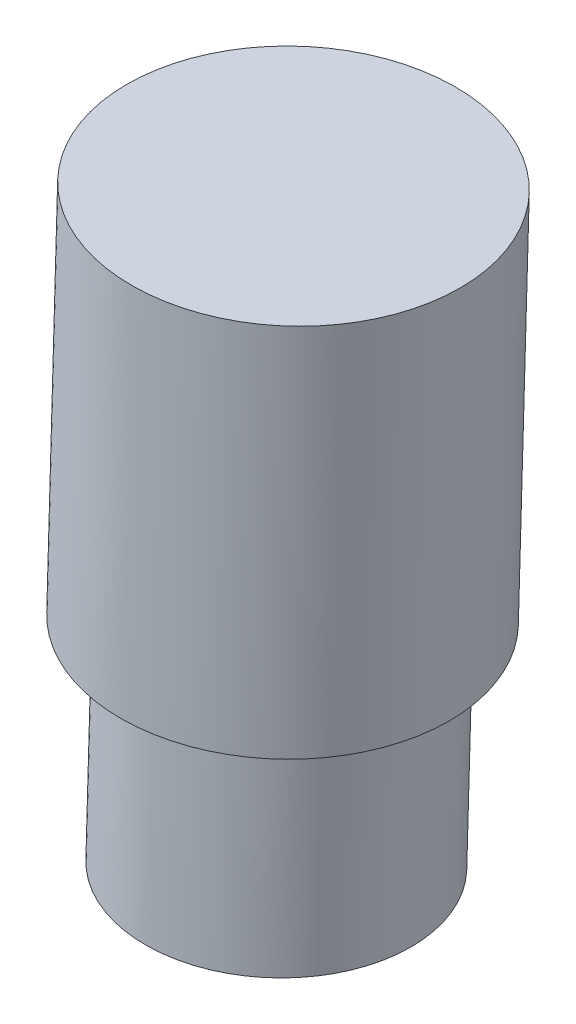
ISO-10303-21;
HEADER;
FILE_DESCRIPTION(('STEP AP214'),'2;1');
FILE_NAME('part.step','',(''),(''),'','','');
FILE_SCHEMA(('AUTOMOTIVE_DESIGN { 1 0 10303 214 1 1 1 1 }'));
ENDSEC;
DATA;
#1=APPLICATION_CONTEXT('core data for automotive mechanical design processes');
#2=APPLICATION_PROTOCOL_DEFINITION('international standard','automotive_design',2000,#1);
#3=PRODUCT_CONTEXT('',#1,'mechanical');
#4=PRODUCT('Part','Part','',(#3));
#5=PRODUCT_RELATED_PRODUCT_CATEGORY('part','',(#4));
#6=PRODUCT_DEFINITION_FORMATION('','',#4);
#7=PRODUCT_DEFINITION_CONTEXT('part definition',#1,'design');
#8=PRODUCT_DEFINITION('design','',#6,#7);
#9=PRODUCT_DEFINITION_SHAPE('','',#8);
#10=(LENGTH_UNIT() NAMED_UNIT(*) SI_UNIT(.MILLI.,.METRE.));
#11=(NAMED_UNIT(*) PLANE_ANGLE_UNIT() SI_UNIT($,.RADIAN.));
#12=(NAMED_UNIT(*) SI_UNIT($,.STERADIAN.) SOLID_ANGLE_UNIT());
#13=UNCERTAINTY_MEASURE_WITH_UNIT(LENGTH_MEASURE(1.E-05),#10,'distance_accuracy_value','');
#14=(GEOMETRIC_REPRESENTATION_CONTEXT(3) GLOBAL_UNCERTAINTY_ASSIGNED_CONTEXT((#13)) GLOBAL_UNIT_ASSIGNED_CONTEXT((#10,
#11,#12)) REPRESENTATION_CONTEXT('',''));
#15=CARTESIAN_POINT('',(0.,0.,0.));
#16=DIRECTION('',(0.,0.,1.));
#17=DIRECTION('',(1.,0.,0.));
#18=AXIS2_PLACEMENT_3D('',#15,#16,#17);
#19=CARTESIAN_POINT('',(-234.568156967119,3.59017791687648,-182.350120167));
#20=DIRECTION('',(0.028773214958104,0.999585965338137,0.));
#21=DIRECTION('',(-0.999585965338137,0.028773214958104,0.));
#22=AXIS2_PLACEMENT_3D('',#19,#20,#21);
#23=CYLINDRICAL_SURFACE('',#22,7.74730145463);
#24=CARTESIAN_POINT('',(-234.561745648129,3.81290813630594,-182.350120167));
#25=DIRECTION('',(0.028773214958104,0.999585965338137,0.));
#26=DIRECTION('',(-0.999585965338137,0.028773214958104,0.));
#27=AXIS2_PLACEMENT_3D('',#24,#25,#26);
#28=CIRCLE('',#27,7.74730145463);
#29=CARTESIAN_POINT('',(-242.305839451421,4.03582290640524,-182.350120167));
#30=VERTEX_POINT('',#29);
#31=EDGE_CURVE('E10',#30,#30,#28,.T.);
#32=ORIENTED_EDGE('',*,*,#31,.T.);
#33=EDGE_LOOP('',(#32));
#34=FACE_BOUND('',#33,.T.);
#35=CARTESIAN_POINT('',(-234.204372176845,16.2281181432433,-182.350120167));
#36=DIRECTION('',(0.028773214958104,0.999585965338137,0.));
#37=DIRECTION('',(-0.999585965338137,0.028773214958104,0.));
#38=AXIS2_PLACEMENT_3D('',#35,#36,#37);
#39=CIRCLE('',#38,7.74730145463);
#40=CARTESIAN_POINT('',(-241.948465980137,16.4510329133426,-182.350120167));
#41=VERTEX_POINT('',#40);
#42=EDGE_CURVE('E50',#41,#41,#39,.T.);
#43=ORIENTED_EDGE('',*,*,#42,.F.);
#44=EDGE_LOOP('',(#43));
#45=FACE_BOUND('',#44,.T.);
#46=ADVANCED_FACE('F36',(#34,#45),#23,.T.);
#47=CARTESIAN_POINT('',(-226.817651844837,3.58999336621552,-182.350120167));
#48=DIRECTION('',(-0.028773214958104,-0.999585965338137,0.));
#49=DIRECTION('',(0.999585965338137,-0.028773214958104,0.));
#50=AXIS2_PLACEMENT_3D('',#47,#48,#49);
#51=PLANE('',#50);
#52=ORIENTED_EDGE('',*,*,#31,.F.);
#53=EDGE_LOOP('',(#52));
#54=FACE_BOUND('',#53,.T.);
#55=ADVANCED_FACE('F60',(#54),#51,.T.);
#56=CARTESIAN_POINT('',(-233.574533705873,38.108804640422,-182.350120167));
#57=DIRECTION('',(0.028773214958104,0.999585965338137,0.));
#58=DIRECTION('',(-0.999585965338137,0.028773214958104,0.));
#59=AXIS2_PLACEMENT_3D('',#56,#57,#58);
#60=PLANE('',#59);
#61=CARTESIAN_POINT('',(-233.574533705874,38.1088046403943,-182.350120167));
#62=DIRECTION('',(0.028773214958104,0.999585965338137,0.));
#63=DIRECTION('',(-0.999585965338137,0.028773214958104,0.));
#64=AXIS2_PLACEMENT_3D('',#61,#62,#63);
#65=CIRCLE('',#64,9.59268424875998);
#66=CARTESIAN_POINT('',(-243.163246250854,38.384817006309,-182.350120167));
#67=VERTEX_POINT('',#66);
#68=EDGE_CURVE('E42',#67,#67,#65,.T.);
#69=ORIENTED_EDGE('',*,*,#68,.T.);
#70=EDGE_LOOP('',(#69));
#71=FACE_BOUND('',#70,.T.);
#72=ADVANCED_FACE('F64',(#71),#60,.T.);
#73=CARTESIAN_POINT('',(-234.568156967119,3.59017791687648,-182.350120167));
#74=DIRECTION('',(0.028773214958104,0.999585965338137,0.));
#75=DIRECTION('',(-0.999585965338137,0.028773214958104,0.));
#76=AXIS2_PLACEMENT_3D('',#73,#74,#75);
#77=CYLINDRICAL_SURFACE('',#76,9.59268424875998);
#78=CARTESIAN_POINT('',(-234.204372176847,16.2281181431977,-182.350120167));
#79=DIRECTION('',(0.028773214958104,0.999585965338137,0.));
#80=DIRECTION('',(-0.999585965338137,0.028773214958104,0.));
#81=AXIS2_PLACEMENT_3D('',#78,#79,#80);
#82=CIRCLE('',#81,9.59268424876);
#83=CARTESIAN_POINT('',(-243.793084721827,16.5041305091125,-182.350120167));
#84=VERTEX_POINT('',#83);
#85=EDGE_CURVE('E46',#84,#84,#82,.T.);
#86=ORIENTED_EDGE('',*,*,#85,.T.);
#87=EDGE_LOOP('',(#86));
#88=FACE_BOUND('',#87,.T.);
#89=ORIENTED_EDGE('',*,*,#68,.F.);
#90=EDGE_LOOP('',(#89));
#91=FACE_BOUND('',#90,.T.);
#92=ADVANCED_FACE('F69',(#88,#91),#77,.T.);
#93=CARTESIAN_POINT('',(-224.615659631865,15.9521057773057,-182.350120167));
#94=DIRECTION('',(-0.028773214958104,-0.999585965338137,0.));
#95=DIRECTION('',(0.999585965338137,-0.028773214958104,0.));
#96=AXIS2_PLACEMENT_3D('',#93,#94,#95);
#97=PLANE('',#96);
#98=ORIENTED_EDGE('',*,*,#42,.T.);
#99=EDGE_LOOP('',(#98));
#100=FACE_BOUND('',#99,.T.);
#101=ORIENTED_EDGE('',*,*,#85,.F.);
#102=EDGE_LOOP('',(#101));
#103=FACE_BOUND('',#102,.T.);
#104=ADVANCED_FACE('F56',(#100,#103),#97,.T.);
#105=CLOSED_SHELL('',(#46,#55,#72,#92,#104));
#106=MANIFOLD_SOLID_BREP('B2',#105);
#107=ADVANCED_BREP_SHAPE_REPRESENTATION('',(#18,#106),#14);
#108=SHAPE_DEFINITION_REPRESENTATION(#9,#107);
ENDSEC;
END-ISO-10303-21;
